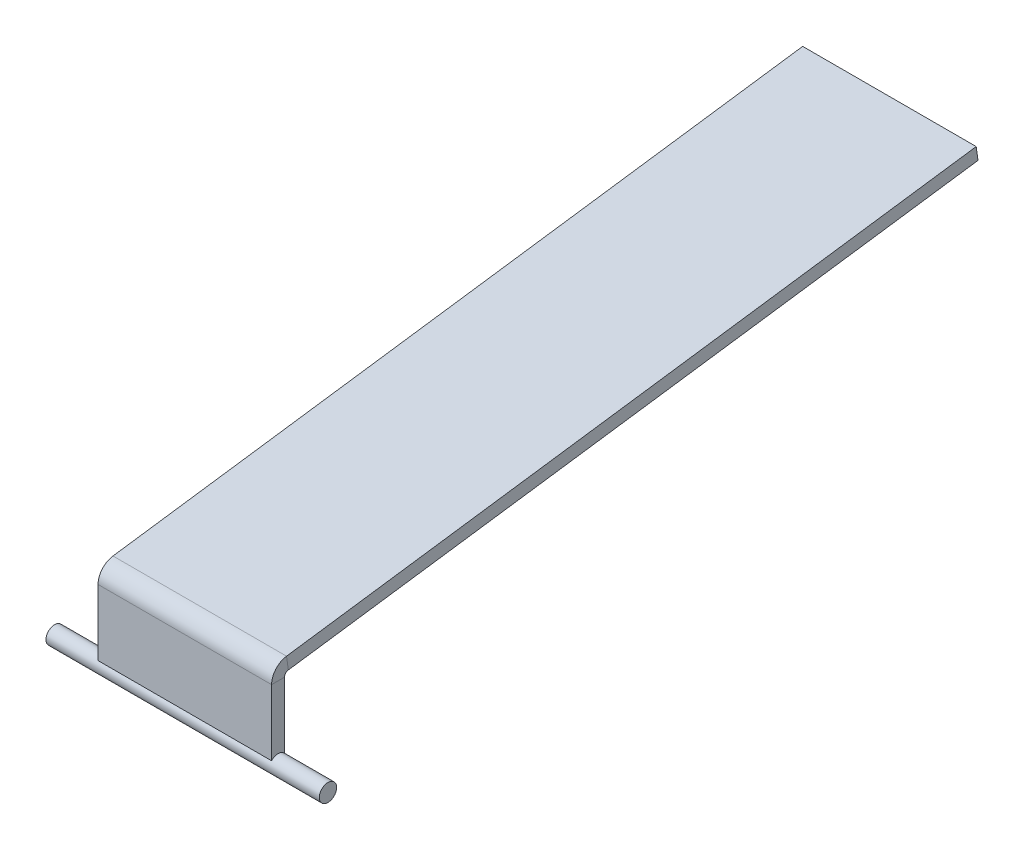
ISO-10303-21;
HEADER;
FILE_DESCRIPTION(('STEP AP214'),'2;1');
FILE_NAME('part.step','',(''),(''),'','','');
FILE_SCHEMA(('AUTOMOTIVE_DESIGN { 1 0 10303 214 1 1 1 1 }'));
ENDSEC;
DATA;
#1=APPLICATION_CONTEXT('core data for automotive mechanical design processes');
#2=APPLICATION_PROTOCOL_DEFINITION('international standard','automotive_design',2000,#1);
#3=PRODUCT_CONTEXT('',#1,'mechanical');
#4=PRODUCT('Part','Part','',(#3));
#5=PRODUCT_RELATED_PRODUCT_CATEGORY('part','',(#4));
#6=PRODUCT_DEFINITION_FORMATION('','',#4);
#7=PRODUCT_DEFINITION_CONTEXT('part definition',#1,'design');
#8=PRODUCT_DEFINITION('design','',#6,#7);
#9=PRODUCT_DEFINITION_SHAPE('','',#8);
#10=(LENGTH_UNIT() NAMED_UNIT(*) SI_UNIT(.MILLI.,.METRE.));
#11=(NAMED_UNIT(*) PLANE_ANGLE_UNIT() SI_UNIT($,.RADIAN.));
#12=(NAMED_UNIT(*) SI_UNIT($,.STERADIAN.) SOLID_ANGLE_UNIT());
#13=UNCERTAINTY_MEASURE_WITH_UNIT(LENGTH_MEASURE(1.E-05),#10,'distance_accuracy_value','');
#14=(GEOMETRIC_REPRESENTATION_CONTEXT(3) GLOBAL_UNCERTAINTY_ASSIGNED_CONTEXT((#13)) GLOBAL_UNIT_ASSIGNED_CONTEXT((#10,
#11,#12)) REPRESENTATION_CONTEXT('',''));
#15=CARTESIAN_POINT('',(0.,0.,0.));
#16=DIRECTION('',(0.,0.,1.));
#17=DIRECTION('',(1.,0.,0.));
#18=AXIS2_PLACEMENT_3D('',#15,#16,#17);
#19=CARTESIAN_POINT('',(2.,0.,0.));
#20=DIRECTION('',(0.,0.,1.));
#21=DIRECTION('',(1.,0.,0.));
#22=AXIS2_PLACEMENT_3D('',#19,#20,#21);
#23=PLANE('',#22);
#24=DIRECTION('',(0.,1.,0.));
#25=VECTOR('',#24,1.);
#26=CARTESIAN_POINT('',(-2.,0.,0.));
#27=LINE('',#26,#25);
#28=CARTESIAN_POINT('',(-2.,0.33228756555323,0.));
#29=VERTEX_POINT('',#28);
#30=CARTESIAN_POINT('',(-2.,1.85207502322455,0.));
#31=VERTEX_POINT('',#30);
#32=EDGE_CURVE('E161',#29,#31,#27,.T.);
#33=ORIENTED_EDGE('',*,*,#32,.F.);
#34=DIRECTION('',(-1.,0.,0.));
#35=VECTOR('',#34,1.);
#36=CARTESIAN_POINT('',(3.15,0.33228756555323,0.));
#37=LINE('',#36,#35);
#38=CARTESIAN_POINT('',(2.,0.33228756555323,0.));
#39=VERTEX_POINT('',#38);
#40=EDGE_CURVE('E118',#29,#39,#37,.F.);
#41=ORIENTED_EDGE('',*,*,#40,.T.);
#42=DIRECTION('',(0.,1.,0.));
#43=VECTOR('',#42,1.);
#44=CARTESIAN_POINT('',(2.,0.,0.));
#45=LINE('',#44,#43);
#46=CARTESIAN_POINT('',(2.,1.85207502322455,0.));
#47=VERTEX_POINT('',#46);
#48=EDGE_CURVE('E110',#39,#47,#45,.T.);
#49=ORIENTED_EDGE('',*,*,#48,.T.);
#50=DIRECTION('',(-1.,0.,0.));
#51=VECTOR('',#50,1.);
#52=CARTESIAN_POINT('',(2.,1.85207502322455,0.));
#53=LINE('',#52,#51);
#54=EDGE_CURVE('E114',#47,#31,#53,.T.);
#55=ORIENTED_EDGE('',*,*,#54,.T.);
#56=EDGE_LOOP('',(#33,#41,#49,#55));
#57=FACE_BOUND('',#56,.T.);
#58=ADVANCED_FACE('F41',(#57),#23,.T.);
#59=CARTESIAN_POINT('',(2.,0.,-0.3));
#60=DIRECTION('',(0.,0.,1.));
#61=DIRECTION('',(1.,0.,0.));
#62=AXIS2_PLACEMENT_3D('',#59,#60,#61);
#63=PLANE('',#62);
#64=DIRECTION('',(-1.,0.,0.));
#65=VECTOR('',#64,1.);
#66=CARTESIAN_POINT('',(3.15,0.33228756555323,-0.3));
#67=LINE('',#66,#65);
#68=CARTESIAN_POINT('',(-2.,0.33228756555323,-0.3));
#69=VERTEX_POINT('',#68);
#70=CARTESIAN_POINT('',(2.,0.33228756555323,-0.3));
#71=VERTEX_POINT('',#70);
#72=EDGE_CURVE('E56',#69,#71,#67,.F.);
#73=ORIENTED_EDGE('',*,*,#72,.F.);
#74=DIRECTION('',(0.,1.,0.));
#75=VECTOR('',#74,1.);
#76=CARTESIAN_POINT('',(-2.,0.,-0.3));
#77=LINE('',#76,#75);
#78=CARTESIAN_POINT('',(-2.,1.85207502322455,-0.3));
#79=VERTEX_POINT('',#78);
#80=EDGE_CURVE('E163',#69,#79,#77,.T.);
#81=ORIENTED_EDGE('',*,*,#80,.T.);
#82=DIRECTION('',(-1.,0.,0.));
#83=VECTOR('',#82,1.);
#84=CARTESIAN_POINT('',(2.,1.85207502322455,-0.3));
#85=LINE('',#84,#83);
#86=CARTESIAN_POINT('',(2.,1.85207502322455,-0.3));
#87=VERTEX_POINT('',#86);
#88=EDGE_CURVE('E136',#87,#79,#85,.T.);
#89=ORIENTED_EDGE('',*,*,#88,.F.);
#90=DIRECTION('',(0.,1.,0.));
#91=VECTOR('',#90,1.);
#92=CARTESIAN_POINT('',(2.,0.,-0.3));
#93=LINE('',#92,#91);
#94=EDGE_CURVE('E120',#71,#87,#93,.T.);
#95=ORIENTED_EDGE('',*,*,#94,.F.);
#96=EDGE_LOOP('',(#73,#81,#89,#95));
#97=FACE_BOUND('',#96,.T.);
#98=ADVANCED_FACE('F203',(#97),#63,.F.);
#99=CARTESIAN_POINT('',(-2.,1.95111014481228,-0.386141980945912));
#100=DIRECTION('',(-1.,0.,0.));
#101=DIRECTION('',(0.,0.,1.));
#102=AXIS2_PLACEMENT_3D('',#99,#100,#101);
#103=PLANE('',#102);
#104=ORIENTED_EDGE('',*,*,#80,.F.);
#105=CARTESIAN_POINT('',(-2.,0.2,-0.15));
#106=DIRECTION('',(-1.,0.,0.));
#107=DIRECTION('',(0.,0.,1.));
#108=AXIS2_PLACEMENT_3D('',#105,#106,#107);
#109=CIRCLE('',#108,0.2);
#110=EDGE_CURVE('E304',#69,#29,#109,.F.);
#111=ORIENTED_EDGE('',*,*,#110,.T.);
#112=ORIENTED_EDGE('',*,*,#32,.T.);
#113=DIRECTION('',(0.,0.,-1.));
#114=VECTOR('',#113,1.);
#115=CARTESIAN_POINT('',(-2.,1.85207502322455,0.));
#116=LINE('',#115,#114);
#117=EDGE_CURVE('E129',#31,#79,#116,.T.);
#118=ORIENTED_EDGE('',*,*,#117,.T.);
#119=EDGE_LOOP('',(#104,#111,#112,#118));
#120=FACE_BOUND('',#119,.T.);
#121=ADVANCED_FACE('F181',(#120),#103,.T.);
#122=CARTESIAN_POINT('',(2.,1.85207502322455,-0.4));
#123=DIRECTION('',(1.,0.,0.));
#124=DIRECTION('',(0.,0.,-1.));
#125=AXIS2_PLACEMENT_3D('',#122,#123,#124);
#126=PLANE('',#125);
#127=ORIENTED_EDGE('',*,*,#48,.F.);
#128=CARTESIAN_POINT('',(2.,0.2,-0.15));
#129=DIRECTION('',(1.,0.,0.));
#130=DIRECTION('',(0.,0.,-1.));
#131=AXIS2_PLACEMENT_3D('',#128,#129,#130);
#132=CIRCLE('',#131,0.2);
#133=EDGE_CURVE('E298',#39,#71,#132,.F.);
#134=ORIENTED_EDGE('',*,*,#133,.T.);
#135=ORIENTED_EDGE('',*,*,#94,.T.);
#136=DIRECTION('',(0.,0.,1.));
#137=VECTOR('',#136,1.);
#138=CARTESIAN_POINT('',(2.,1.85207502322455,-0.3));
#139=LINE('',#138,#137);
#140=EDGE_CURVE('E49',#87,#47,#139,.T.);
#141=ORIENTED_EDGE('',*,*,#140,.T.);
#142=EDGE_LOOP('',(#127,#134,#135,#141));
#143=FACE_BOUND('',#142,.T.);
#144=ADVANCED_FACE('F124',(#143),#126,.T.);
#145=CARTESIAN_POINT('',(2.,2.24821550957547,-0.344567923783648));
#146=DIRECTION('',(1.,0.,0.));
#147=DIRECTION('',(0.,0.,-1.));
#148=AXIS2_PLACEMENT_3D('',#145,#146,#147);
#149=PLANE('',#148);
#150=DIRECTION('',(0.,-0.990351215877303,-0.138580190540881));
#151=VECTOR('',#150,1.);
#152=CARTESIAN_POINT('',(2.,2.24821550957547,-0.344567923783648));
#153=LINE('',#152,#151);
#154=CARTESIAN_POINT('',(2.,2.24821550957547,-0.344567923783648));
#155=VERTEX_POINT('',#154);
#156=CARTESIAN_POINT('',(2.,1.95111014481228,-0.386141980945912));
#157=VERTEX_POINT('',#156);
#158=EDGE_CURVE('E11',#155,#157,#153,.T.);
#159=ORIENTED_EDGE('',*,*,#158,.F.);
#160=CARTESIAN_POINT('',(2.,1.85207502322455,-0.4));
#161=DIRECTION('',(1.,0.,0.));
#162=DIRECTION('',(0.,0.,-1.));
#163=AXIS2_PLACEMENT_3D('',#160,#161,#162);
#164=CIRCLE('',#163,0.4);
#165=EDGE_CURVE('E121',#47,#155,#164,.F.);
#166=ORIENTED_EDGE('',*,*,#165,.F.);
#167=ORIENTED_EDGE('',*,*,#140,.F.);
#168=CARTESIAN_POINT('',(2.,1.85207502322455,-0.4));
#169=DIRECTION('',(1.,0.,0.));
#170=DIRECTION('',(0.,0.,-1.));
#171=AXIS2_PLACEMENT_3D('',#168,#169,#170);
#172=CIRCLE('',#171,0.1);
#173=EDGE_CURVE('E147',#87,#157,#172,.F.);
#174=ORIENTED_EDGE('',*,*,#173,.T.);
#175=EDGE_LOOP('',(#159,#166,#167,#174));
#176=FACE_BOUND('',#175,.T.);
#177=ADVANCED_FACE('F43',(#176),#149,.T.);
#178=CARTESIAN_POINT('',(2.,1.85207502322455,-0.3));
#179=DIRECTION('',(1.,0.,0.));
#180=DIRECTION('',(0.,0.,-1.));
#181=AXIS2_PLACEMENT_3D('',#178,#179,#180);
#182=PLANE('',#181);
#183=DIRECTION('',(0.,0.13858019054088,-0.990351215877303));
#184=VECTOR('',#183,1.);
#185=CARTESIAN_POINT('',(2.,2.2,0.));
#186=LINE('',#185,#184);
#187=CARTESIAN_POINT('',(2.,4.47271512487044,-16.2417599403878));
#188=VERTEX_POINT('',#187);
#189=EDGE_CURVE('E139',#155,#188,#186,.T.);
#190=ORIENTED_EDGE('',*,*,#189,.F.);
#191=ORIENTED_EDGE('',*,*,#158,.T.);
#192=DIRECTION('',(0.,0.13858019054088,-0.990351215877304));
#193=VECTOR('',#192,1.);
#194=CARTESIAN_POINT('',(2.,1.90289463523681,-0.0415740571622641));
#195=LINE('',#194,#193);
#196=CARTESIAN_POINT('',(2.,4.17560976010725,-16.28333399755));
#197=VERTEX_POINT('',#196);
#198=EDGE_CURVE('E97',#157,#197,#195,.T.);
#199=ORIENTED_EDGE('',*,*,#198,.T.);
#200=DIRECTION('',(0.,-0.990351215877302,-0.13858019054089));
#201=VECTOR('',#200,1.);
#202=CARTESIAN_POINT('',(2.,4.47271512487044,-16.2417599403878));
#203=LINE('',#202,#201);
#204=EDGE_CURVE('E142',#188,#197,#203,.T.);
#205=ORIENTED_EDGE('',*,*,#204,.F.);
#206=EDGE_LOOP('',(#190,#191,#199,#205));
#207=FACE_BOUND('',#206,.T.);
#208=ADVANCED_FACE('F192',(#207),#182,.T.);
#209=CARTESIAN_POINT('',(-2.,1.85207502322455,0.));
#210=DIRECTION('',(-1.,0.,0.));
#211=DIRECTION('',(0.,0.,1.));
#212=AXIS2_PLACEMENT_3D('',#209,#210,#211);
#213=PLANE('',#212);
#214=ORIENTED_EDGE('',*,*,#117,.F.);
#215=CARTESIAN_POINT('',(-2.,1.85207502322455,-0.4));
#216=DIRECTION('',(1.,0.,0.));
#217=DIRECTION('',(0.,0.,-1.));
#218=AXIS2_PLACEMENT_3D('',#215,#216,#217);
#219=CIRCLE('',#218,0.4);
#220=CARTESIAN_POINT('',(-2.,2.24821550957547,-0.344567923783648));
#221=VERTEX_POINT('',#220);
#222=EDGE_CURVE('E134',#31,#221,#219,.F.);
#223=ORIENTED_EDGE('',*,*,#222,.T.);
#224=DIRECTION('',(0.,0.990351215877303,0.138580190540881));
#225=VECTOR('',#224,1.);
#226=CARTESIAN_POINT('',(-2.,1.95111014481228,-0.386141980945912));
#227=LINE('',#226,#225);
#228=CARTESIAN_POINT('',(-2.,1.95111014481228,-0.386141980945912));
#229=VERTEX_POINT('',#228);
#230=EDGE_CURVE('E91',#229,#221,#227,.T.);
#231=ORIENTED_EDGE('',*,*,#230,.F.);
#232=CARTESIAN_POINT('',(-2.,1.85207502322455,-0.4));
#233=DIRECTION('',(1.,0.,0.));
#234=DIRECTION('',(0.,0.,-1.));
#235=AXIS2_PLACEMENT_3D('',#232,#233,#234);
#236=CIRCLE('',#235,0.1);
#237=EDGE_CURVE('E165',#79,#229,#236,.F.);
#238=ORIENTED_EDGE('',*,*,#237,.F.);
#239=EDGE_LOOP('',(#214,#223,#231,#238));
#240=FACE_BOUND('',#239,.T.);
#241=ADVANCED_FACE('F189',(#240),#213,.T.);
#242=CARTESIAN_POINT('',(2.,1.90289463523681,-0.0415740571622641));
#243=DIRECTION('',(0.,0.990351215877303,0.13858019054088));
#244=DIRECTION('',(0.,-0.13858019054088,0.990351215877303));
#245=AXIS2_PLACEMENT_3D('',#242,#243,#244);
#246=PLANE('',#245);
#247=DIRECTION('',(0.,0.13858019054088,-0.990351215877304));
#248=VECTOR('',#247,1.);
#249=CARTESIAN_POINT('',(-2.,1.90289463523681,-0.0415740571622641));
#250=LINE('',#249,#248);
#251=CARTESIAN_POINT('',(-2.,4.17560976010725,-16.28333399755));
#252=VERTEX_POINT('',#251);
#253=EDGE_CURVE('E150',#229,#252,#250,.T.);
#254=ORIENTED_EDGE('',*,*,#253,.T.);
#255=DIRECTION('',(-1.,0.,0.));
#256=VECTOR('',#255,1.);
#257=CARTESIAN_POINT('',(2.,4.17560976010725,-16.28333399755));
#258=LINE('',#257,#256);
#259=EDGE_CURVE('E174',#197,#252,#258,.T.);
#260=ORIENTED_EDGE('',*,*,#259,.F.);
#261=ORIENTED_EDGE('',*,*,#198,.F.);
#262=DIRECTION('',(-1.,0.,0.));
#263=VECTOR('',#262,1.);
#264=CARTESIAN_POINT('',(2.,1.95111014481228,-0.386141980945912));
#265=LINE('',#264,#263);
#266=EDGE_CURVE('E149',#157,#229,#265,.T.);
#267=ORIENTED_EDGE('',*,*,#266,.T.);
#268=EDGE_LOOP('',(#254,#260,#261,#267));
#269=FACE_BOUND('',#268,.T.);
#270=ADVANCED_FACE('F191',(#269),#246,.F.);
#271=CARTESIAN_POINT('',(2.,4.47271512487044,-16.2417599403878));
#272=DIRECTION('',(0.,0.13858019054089,-0.990351215877302));
#273=DIRECTION('',(0.,0.990351215877302,0.13858019054089));
#274=AXIS2_PLACEMENT_3D('',#271,#272,#273);
#275=PLANE('',#274);
#276=DIRECTION('',(0.,-0.990351215877302,-0.13858019054089));
#277=VECTOR('',#276,1.);
#278=CARTESIAN_POINT('',(-2.,4.47271512487044,-16.2417599403878));
#279=LINE('',#278,#277);
#280=CARTESIAN_POINT('',(-2.,4.47271512487044,-16.2417599403878));
#281=VERTEX_POINT('',#280);
#282=EDGE_CURVE('E153',#281,#252,#279,.T.);
#283=ORIENTED_EDGE('',*,*,#282,.F.);
#284=DIRECTION('',(-1.,0.,0.));
#285=VECTOR('',#284,1.);
#286=CARTESIAN_POINT('',(2.,4.47271512487044,-16.2417599403878));
#287=LINE('',#286,#285);
#288=EDGE_CURVE('E172',#188,#281,#287,.T.);
#289=ORIENTED_EDGE('',*,*,#288,.F.);
#290=ORIENTED_EDGE('',*,*,#204,.T.);
#291=ORIENTED_EDGE('',*,*,#259,.T.);
#292=EDGE_LOOP('',(#283,#289,#290,#291));
#293=FACE_BOUND('',#292,.T.);
#294=ADVANCED_FACE('F198',(#293),#275,.T.);
#295=CARTESIAN_POINT('',(2.,2.2,0.));
#296=DIRECTION('',(0.,0.990351215877303,0.13858019054088));
#297=DIRECTION('',(0.,-0.13858019054088,0.990351215877303));
#298=AXIS2_PLACEMENT_3D('',#295,#296,#297);
#299=PLANE('',#298);
#300=DIRECTION('',(0.,0.13858019054088,-0.990351215877303));
#301=VECTOR('',#300,1.);
#302=CARTESIAN_POINT('',(-2.,2.2,0.));
#303=LINE('',#302,#301);
#304=EDGE_CURVE('E157',#221,#281,#303,.T.);
#305=ORIENTED_EDGE('',*,*,#304,.F.);
#306=DIRECTION('',(-1.,0.,0.));
#307=VECTOR('',#306,1.);
#308=CARTESIAN_POINT('',(2.,2.24821550957547,-0.344567923783648));
#309=LINE('',#308,#307);
#310=EDGE_CURVE('E135',#155,#221,#309,.T.);
#311=ORIENTED_EDGE('',*,*,#310,.F.);
#312=ORIENTED_EDGE('',*,*,#189,.T.);
#313=ORIENTED_EDGE('',*,*,#288,.T.);
#314=EDGE_LOOP('',(#305,#311,#312,#313));
#315=FACE_BOUND('',#314,.T.);
#316=ADVANCED_FACE('F214',(#315),#299,.T.);
#317=CARTESIAN_POINT('',(2.,1.85207502322455,-0.4));
#318=DIRECTION('',(-1.,0.,0.));
#319=DIRECTION('',(0.,0.,1.));
#320=AXIS2_PLACEMENT_3D('',#317,#318,#319);
#321=CYLINDRICAL_SURFACE('',#320,0.4);
#322=ORIENTED_EDGE('',*,*,#222,.F.);
#323=ORIENTED_EDGE('',*,*,#54,.F.);
#324=ORIENTED_EDGE('',*,*,#165,.T.);
#325=ORIENTED_EDGE('',*,*,#310,.T.);
#326=EDGE_LOOP('',(#322,#323,#324,#325));
#327=FACE_BOUND('',#326,.T.);
#328=ADVANCED_FACE('F132',(#327),#321,.T.);
#329=CARTESIAN_POINT('',(2.,1.85207502322455,-0.4));
#330=DIRECTION('',(-1.,0.,0.));
#331=DIRECTION('',(0.,0.,1.));
#332=AXIS2_PLACEMENT_3D('',#329,#330,#331);
#333=CYLINDRICAL_SURFACE('',#332,0.1);
#334=ORIENTED_EDGE('',*,*,#237,.T.);
#335=ORIENTED_EDGE('',*,*,#266,.F.);
#336=ORIENTED_EDGE('',*,*,#173,.F.);
#337=ORIENTED_EDGE('',*,*,#88,.T.);
#338=EDGE_LOOP('',(#334,#335,#336,#337));
#339=FACE_BOUND('',#338,.T.);
#340=ADVANCED_FACE('F186',(#339),#333,.F.);
#341=CARTESIAN_POINT('',(-2.,1.85207502322455,-0.4));
#342=DIRECTION('',(1.,0.,0.));
#343=DIRECTION('',(0.,0.,-1.));
#344=AXIS2_PLACEMENT_3D('',#341,#342,#343);
#345=PLANE('',#344);
#346=ORIENTED_EDGE('',*,*,#253,.F.);
#347=ORIENTED_EDGE('',*,*,#230,.T.);
#348=ORIENTED_EDGE('',*,*,#304,.T.);
#349=ORIENTED_EDGE('',*,*,#282,.T.);
#350=EDGE_LOOP('',(#346,#347,#348,#349));
#351=FACE_BOUND('',#350,.T.);
#352=ADVANCED_FACE('F234',(#351),#345,.F.);
#353=CARTESIAN_POINT('',(3.15,0.2,-0.15));
#354=DIRECTION('',(-1.,0.,0.));
#355=DIRECTION('',(0.,0.,1.));
#356=AXIS2_PLACEMENT_3D('',#353,#354,#355);
#357=CYLINDRICAL_SURFACE('',#356,0.2);
#358=CARTESIAN_POINT('',(2.,0.2,-0.15));
#359=DIRECTION('',(-1.,0.,0.));
#360=DIRECTION('',(0.,-0.661437827766148,-0.75));
#361=AXIS2_PLACEMENT_3D('',#358,#359,#360);
#362=CIRCLE('',#361,0.2);
#363=CARTESIAN_POINT('',(2.,0.0677124344467704,-0.3));
#364=VERTEX_POINT('',#363);
#365=CARTESIAN_POINT('',(2.,0.0677124344467704,0.));
#366=VERTEX_POINT('',#365);
#367=EDGE_CURVE('E154',#364,#366,#362,.T.);
#368=ORIENTED_EDGE('',*,*,#367,.T.);
#369=ORIENTED_EDGE('',*,*,#367,.F.);
#370=EDGE_LOOP('',(#368,#369));
#371=FACE_BOUND('',#370,.T.);
#372=CARTESIAN_POINT('',(-2.,0.2,-0.15));
#373=DIRECTION('',(-1.,0.,0.));
#374=DIRECTION('',(0.,-0.661437827766148,-0.75));
#375=AXIS2_PLACEMENT_3D('',#372,#373,#374);
#376=CIRCLE('',#375,0.2);
#377=CARTESIAN_POINT('',(-2.,0.0677124344467704,-0.3));
#378=VERTEX_POINT('',#377);
#379=CARTESIAN_POINT('',(-2.,0.0677124344467704,0.));
#380=VERTEX_POINT('',#379);
#381=EDGE_CURVE('E306',#378,#380,#376,.T.);
#382=ORIENTED_EDGE('',*,*,#381,.F.);
#383=ORIENTED_EDGE('',*,*,#381,.T.);
#384=EDGE_LOOP('',(#382,#383));
#385=FACE_BOUND('',#384,.T.);
#386=ORIENTED_EDGE('',*,*,#110,.F.);
#387=ORIENTED_EDGE('',*,*,#72,.T.);
#388=ORIENTED_EDGE('',*,*,#133,.F.);
#389=ORIENTED_EDGE('',*,*,#40,.F.);
#390=EDGE_LOOP('',(#386,#387,#388,#389));
#391=FACE_BOUND('',#390,.T.);
#392=CARTESIAN_POINT('',(3.15,0.2,-0.15));
#393=DIRECTION('',(1.,0.,0.));
#394=DIRECTION('',(0.,0.,-1.));
#395=AXIS2_PLACEMENT_3D('',#392,#393,#394);
#396=CIRCLE('',#395,0.2);
#397=CARTESIAN_POINT('',(3.15,0.2,-0.35));
#398=VERTEX_POINT('',#397);
#399=EDGE_CURVE('E295',#398,#398,#396,.T.);
#400=ORIENTED_EDGE('',*,*,#399,.F.);
#401=EDGE_LOOP('',(#400));
#402=FACE_BOUND('',#401,.T.);
#403=CARTESIAN_POINT('',(-3.15,0.2,-0.15));
#404=DIRECTION('',(1.,0.,0.));
#405=DIRECTION('',(0.,0.,-1.));
#406=AXIS2_PLACEMENT_3D('',#403,#404,#405);
#407=CIRCLE('',#406,0.2);
#408=CARTESIAN_POINT('',(-3.15,0.2,-0.35));
#409=VERTEX_POINT('',#408);
#410=EDGE_CURVE('E293',#409,#409,#407,.T.);
#411=ORIENTED_EDGE('',*,*,#410,.T.);
#412=EDGE_LOOP('',(#411));
#413=FACE_BOUND('',#412,.T.);
#414=ADVANCED_FACE('F231',(#371,#385,#391,#402,#413),#357,.T.);
#415=CARTESIAN_POINT('',(3.15,0.2,-0.15));
#416=DIRECTION('',(1.,0.,0.));
#417=DIRECTION('',(0.,0.,-1.));
#418=AXIS2_PLACEMENT_3D('',#415,#416,#417);
#419=PLANE('',#418);
#420=ORIENTED_EDGE('',*,*,#399,.T.);
#421=EDGE_LOOP('',(#420));
#422=FACE_BOUND('',#421,.T.);
#423=ADVANCED_FACE('F275',(#422),#419,.T.);
#424=CARTESIAN_POINT('',(-3.15,0.2,-0.15));
#425=DIRECTION('',(1.,0.,0.));
#426=DIRECTION('',(0.,0.,-1.));
#427=AXIS2_PLACEMENT_3D('',#424,#425,#426);
#428=PLANE('',#427);
#429=ORIENTED_EDGE('',*,*,#410,.F.);
#430=EDGE_LOOP('',(#429));
#431=FACE_BOUND('',#430,.T.);
#432=ADVANCED_FACE('F282',(#431),#428,.F.);
#433=CLOSED_SHELL('',(#58,#98,#121,#144,#177,#208,#241,#270,#294,#316,#328,#340,#352,#414,#423,#432));
#434=MANIFOLD_SOLID_BREP('B2',#433);
#435=ADVANCED_BREP_SHAPE_REPRESENTATION('',(#18,#434),#14);
#436=SHAPE_DEFINITION_REPRESENTATION(#9,#435);
ENDSEC;
END-ISO-10303-21;
